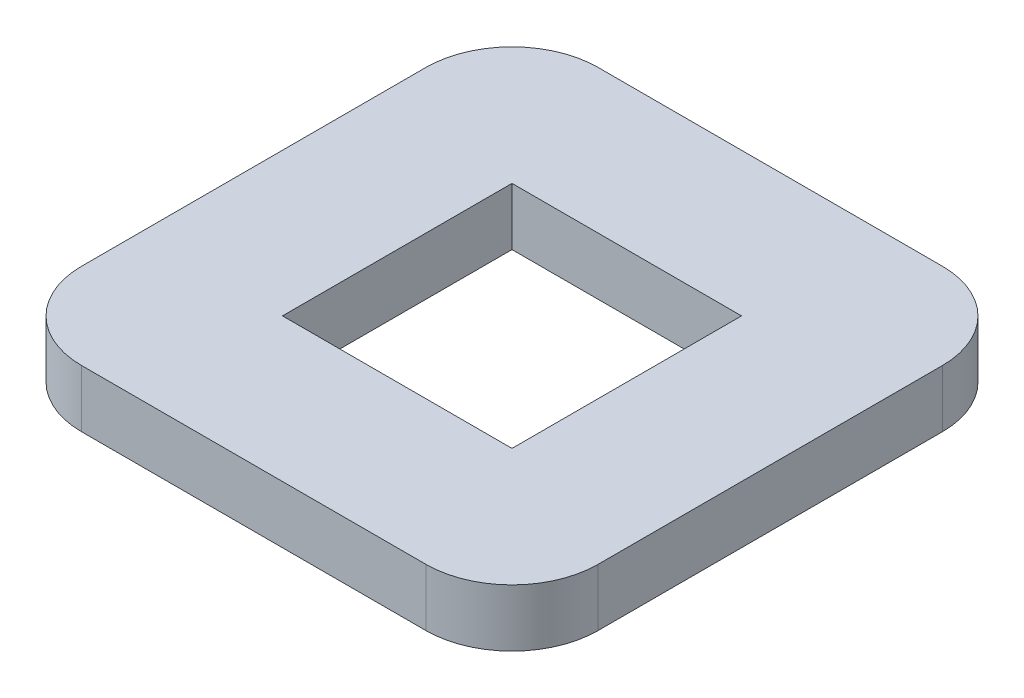
ISO-10303-21;
HEADER;
FILE_DESCRIPTION(('STEP AP214'),'2;1');
FILE_NAME('part.step','',(''),(''),'','','');
FILE_SCHEMA(('AUTOMOTIVE_DESIGN { 1 0 10303 214 1 1 1 1 }'));
ENDSEC;
DATA;
#1=APPLICATION_CONTEXT('core data for automotive mechanical design processes');
#2=APPLICATION_PROTOCOL_DEFINITION('international standard','automotive_design',2000,#1);
#3=PRODUCT_CONTEXT('',#1,'mechanical');
#4=PRODUCT('Part','Part','',(#3));
#5=PRODUCT_RELATED_PRODUCT_CATEGORY('part','',(#4));
#6=PRODUCT_DEFINITION_FORMATION('','',#4);
#7=PRODUCT_DEFINITION_CONTEXT('part definition',#1,'design');
#8=PRODUCT_DEFINITION('design','',#6,#7);
#9=PRODUCT_DEFINITION_SHAPE('','',#8);
#10=(LENGTH_UNIT() NAMED_UNIT(*) SI_UNIT(.MILLI.,.METRE.));
#11=(NAMED_UNIT(*) PLANE_ANGLE_UNIT() SI_UNIT($,.RADIAN.));
#12=(NAMED_UNIT(*) SI_UNIT($,.STERADIAN.) SOLID_ANGLE_UNIT());
#13=UNCERTAINTY_MEASURE_WITH_UNIT(LENGTH_MEASURE(1.E-05),#10,'distance_accuracy_value','');
#14=(GEOMETRIC_REPRESENTATION_CONTEXT(3) GLOBAL_UNCERTAINTY_ASSIGNED_CONTEXT((#13)) GLOBAL_UNIT_ASSIGNED_CONTEXT((#10,
#11,#12)) REPRESENTATION_CONTEXT('',''));
#15=CARTESIAN_POINT('',(0.,0.,0.));
#16=DIRECTION('',(0.,0.,1.));
#17=DIRECTION('',(1.,0.,0.));
#18=AXIS2_PLACEMENT_3D('',#15,#16,#17);
#19=CARTESIAN_POINT('',(6.,2.,-6.));
#20=DIRECTION('',(0.,-1.,0.));
#21=DIRECTION('',(0.,0.,-1.));
#22=AXIS2_PLACEMENT_3D('',#19,#20,#21);
#23=PLANE('',#22);
#24=CARTESIAN_POINT('',(6.,2.,-6.));
#25=DIRECTION('',(0.,1.,0.));
#26=DIRECTION('',(0.,0.,-1.));
#27=AXIS2_PLACEMENT_3D('',#24,#25,#26);
#28=CIRCLE('',#27,3.);
#29=CARTESIAN_POINT('',(9.,2.,-6.));
#30=VERTEX_POINT('',#29);
#31=CARTESIAN_POINT('',(6.,2.,-9.));
#32=VERTEX_POINT('',#31);
#33=EDGE_CURVE('E159',#30,#32,#28,.T.);
#34=ORIENTED_EDGE('',*,*,#33,.T.);
#35=DIRECTION('',(-1.,0.,0.));
#36=VECTOR('',#35,1.);
#37=CARTESIAN_POINT('',(-6.,2.,-9.));
#38=LINE('',#37,#36);
#39=CARTESIAN_POINT('',(-6.,2.,-9.));
#40=VERTEX_POINT('',#39);
#41=EDGE_CURVE('E162',#32,#40,#38,.T.);
#42=ORIENTED_EDGE('',*,*,#41,.T.);
#43=CARTESIAN_POINT('',(-6.,2.,-6.));
#44=DIRECTION('',(0.,1.,0.));
#45=DIRECTION('',(0.,0.,1.));
#46=AXIS2_PLACEMENT_3D('',#43,#44,#45);
#47=CIRCLE('',#46,3.);
#48=CARTESIAN_POINT('',(-9.,2.,-6.));
#49=VERTEX_POINT('',#48);
#50=EDGE_CURVE('E165',#40,#49,#47,.T.);
#51=ORIENTED_EDGE('',*,*,#50,.T.);
#52=DIRECTION('',(0.,0.,1.));
#53=VECTOR('',#52,1.);
#54=CARTESIAN_POINT('',(-9.,2.,-6.));
#55=LINE('',#54,#53);
#56=CARTESIAN_POINT('',(-9.,2.,6.));
#57=VERTEX_POINT('',#56);
#58=EDGE_CURVE('E167',#49,#57,#55,.T.);
#59=ORIENTED_EDGE('',*,*,#58,.T.);
#60=CARTESIAN_POINT('',(-6.,2.,6.));
#61=DIRECTION('',(0.,1.,0.));
#62=DIRECTION('',(0.,0.,-1.));
#63=AXIS2_PLACEMENT_3D('',#60,#61,#62);
#64=CIRCLE('',#63,3.);
#65=CARTESIAN_POINT('',(-6.,2.,9.));
#66=VERTEX_POINT('',#65);
#67=EDGE_CURVE('E169',#57,#66,#64,.T.);
#68=ORIENTED_EDGE('',*,*,#67,.T.);
#69=DIRECTION('',(1.,0.,0.));
#70=VECTOR('',#69,1.);
#71=CARTESIAN_POINT('',(-6.,2.,9.));
#72=LINE('',#71,#70);
#73=CARTESIAN_POINT('',(6.00000000000001,2.,9.));
#74=VERTEX_POINT('',#73);
#75=EDGE_CURVE('E171',#66,#74,#72,.T.);
#76=ORIENTED_EDGE('',*,*,#75,.T.);
#77=CARTESIAN_POINT('',(6.,2.,6.));
#78=DIRECTION('',(0.,1.,0.));
#79=DIRECTION('',(0.,0.,1.));
#80=AXIS2_PLACEMENT_3D('',#77,#78,#79);
#81=CIRCLE('',#80,3.);
#82=CARTESIAN_POINT('',(9.,2.,5.99999999999999));
#83=VERTEX_POINT('',#82);
#84=EDGE_CURVE('E173',#74,#83,#81,.T.);
#85=ORIENTED_EDGE('',*,*,#84,.T.);
#86=DIRECTION('',(0.,0.,-1.));
#87=VECTOR('',#86,1.);
#88=CARTESIAN_POINT('',(9.,2.,-6.));
#89=LINE('',#88,#87);
#90=EDGE_CURVE('E175',#83,#30,#89,.T.);
#91=ORIENTED_EDGE('',*,*,#90,.T.);
#92=EDGE_LOOP('',(#34,#42,#51,#59,#68,#76,#85,#91));
#93=FACE_BOUND('',#92,.T.);
#94=DIRECTION('',(0.,0.,1.));
#95=VECTOR('',#94,1.);
#96=CARTESIAN_POINT('',(-4.,2.,4.));
#97=LINE('',#96,#95);
#98=CARTESIAN_POINT('',(-4.,2.,-4.));
#99=VERTEX_POINT('',#98);
#100=CARTESIAN_POINT('',(-4.,2.,4.));
#101=VERTEX_POINT('',#100);
#102=EDGE_CURVE('E123',#99,#101,#97,.T.);
#103=ORIENTED_EDGE('',*,*,#102,.F.);
#104=DIRECTION('',(-1.,0.,0.));
#105=VECTOR('',#104,1.);
#106=CARTESIAN_POINT('',(4.,2.,-4.));
#107=LINE('',#106,#105);
#108=CARTESIAN_POINT('',(4.,2.,-4.));
#109=VERTEX_POINT('',#108);
#110=EDGE_CURVE('E145',#109,#99,#107,.T.);
#111=ORIENTED_EDGE('',*,*,#110,.F.);
#112=DIRECTION('',(0.,0.,-1.));
#113=VECTOR('',#112,1.);
#114=CARTESIAN_POINT('',(4.,2.,4.));
#115=LINE('',#114,#113);
#116=CARTESIAN_POINT('',(4.,2.,4.));
#117=VERTEX_POINT('',#116);
#118=EDGE_CURVE('E143',#117,#109,#115,.T.);
#119=ORIENTED_EDGE('',*,*,#118,.F.);
#120=DIRECTION('',(1.,0.,0.));
#121=VECTOR('',#120,1.);
#122=CARTESIAN_POINT('',(4.,2.,4.));
#123=LINE('',#122,#121);
#124=EDGE_CURVE('E131',#101,#117,#123,.T.);
#125=ORIENTED_EDGE('',*,*,#124,.F.);
#126=EDGE_LOOP('',(#103,#111,#119,#125));
#127=FACE_BOUND('',#126,.T.);
#128=ADVANCED_FACE('F34',(#93,#127),#23,.F.);
#129=CARTESIAN_POINT('',(6.,0.,-6.));
#130=DIRECTION('',(0.,-1.,0.));
#131=DIRECTION('',(0.,0.,-1.));
#132=AXIS2_PLACEMENT_3D('',#129,#130,#131);
#133=PLANE('',#132);
#134=CARTESIAN_POINT('',(6.,0.,-6.));
#135=DIRECTION('',(0.,1.,0.));
#136=DIRECTION('',(0.,0.,-1.));
#137=AXIS2_PLACEMENT_3D('',#134,#135,#136);
#138=CIRCLE('',#137,3.);
#139=CARTESIAN_POINT('',(9.,0.,-6.));
#140=VERTEX_POINT('',#139);
#141=CARTESIAN_POINT('',(6.,0.,-9.));
#142=VERTEX_POINT('',#141);
#143=EDGE_CURVE('E139',#140,#142,#138,.T.);
#144=ORIENTED_EDGE('',*,*,#143,.F.);
#145=DIRECTION('',(0.,0.,-1.));
#146=VECTOR('',#145,1.);
#147=CARTESIAN_POINT('',(9.,0.,-6.));
#148=LINE('',#147,#146);
#149=CARTESIAN_POINT('',(9.,0.,5.99999999999999));
#150=VERTEX_POINT('',#149);
#151=EDGE_CURVE('E163',#150,#140,#148,.T.);
#152=ORIENTED_EDGE('',*,*,#151,.F.);
#153=CARTESIAN_POINT('',(6.,0.,6.));
#154=DIRECTION('',(0.,1.,0.));
#155=DIRECTION('',(0.,0.,1.));
#156=AXIS2_PLACEMENT_3D('',#153,#154,#155);
#157=CIRCLE('',#156,3.);
#158=CARTESIAN_POINT('',(6.00000000000001,0.,9.));
#159=VERTEX_POINT('',#158);
#160=EDGE_CURVE('E190',#159,#150,#157,.T.);
#161=ORIENTED_EDGE('',*,*,#160,.F.);
#162=DIRECTION('',(1.,0.,0.));
#163=VECTOR('',#162,1.);
#164=CARTESIAN_POINT('',(-6.,0.,9.));
#165=LINE('',#164,#163);
#166=CARTESIAN_POINT('',(-6.,0.,9.));
#167=VERTEX_POINT('',#166);
#168=EDGE_CURVE('E188',#167,#159,#165,.T.);
#169=ORIENTED_EDGE('',*,*,#168,.F.);
#170=CARTESIAN_POINT('',(-6.,0.,6.));
#171=DIRECTION('',(0.,1.,0.));
#172=DIRECTION('',(0.,0.,-1.));
#173=AXIS2_PLACEMENT_3D('',#170,#171,#172);
#174=CIRCLE('',#173,3.);
#175=CARTESIAN_POINT('',(-9.,0.,6.));
#176=VERTEX_POINT('',#175);
#177=EDGE_CURVE('E186',#176,#167,#174,.T.);
#178=ORIENTED_EDGE('',*,*,#177,.F.);
#179=DIRECTION('',(0.,0.,1.));
#180=VECTOR('',#179,1.);
#181=CARTESIAN_POINT('',(-9.,0.,-6.));
#182=LINE('',#181,#180);
#183=CARTESIAN_POINT('',(-9.,0.,-6.));
#184=VERTEX_POINT('',#183);
#185=EDGE_CURVE('E184',#184,#176,#182,.T.);
#186=ORIENTED_EDGE('',*,*,#185,.F.);
#187=CARTESIAN_POINT('',(-6.,0.,-6.));
#188=DIRECTION('',(0.,1.,0.));
#189=DIRECTION('',(0.,0.,1.));
#190=AXIS2_PLACEMENT_3D('',#187,#188,#189);
#191=CIRCLE('',#190,3.);
#192=CARTESIAN_POINT('',(-6.,0.,-9.));
#193=VERTEX_POINT('',#192);
#194=EDGE_CURVE('E182',#193,#184,#191,.T.);
#195=ORIENTED_EDGE('',*,*,#194,.F.);
#196=DIRECTION('',(-1.,0.,0.));
#197=VECTOR('',#196,1.);
#198=CARTESIAN_POINT('',(-6.,0.,-9.));
#199=LINE('',#198,#197);
#200=EDGE_CURVE('E180',#142,#193,#199,.T.);
#201=ORIENTED_EDGE('',*,*,#200,.F.);
#202=EDGE_LOOP('',(#144,#152,#161,#169,#178,#186,#195,#201));
#203=FACE_BOUND('',#202,.T.);
#204=DIRECTION('',(-1.,0.,0.));
#205=VECTOR('',#204,1.);
#206=CARTESIAN_POINT('',(4.,0.,-4.));
#207=LINE('',#206,#205);
#208=CARTESIAN_POINT('',(4.,0.,-4.));
#209=VERTEX_POINT('',#208);
#210=CARTESIAN_POINT('',(-4.,0.,-4.));
#211=VERTEX_POINT('',#210);
#212=EDGE_CURVE('E132',#209,#211,#207,.T.);
#213=ORIENTED_EDGE('',*,*,#212,.T.);
#214=DIRECTION('',(0.,0.,1.));
#215=VECTOR('',#214,1.);
#216=CARTESIAN_POINT('',(-4.,0.,4.));
#217=LINE('',#216,#215);
#218=CARTESIAN_POINT('',(-4.,0.,4.));
#219=VERTEX_POINT('',#218);
#220=EDGE_CURVE('E57',#211,#219,#217,.T.);
#221=ORIENTED_EDGE('',*,*,#220,.T.);
#222=DIRECTION('',(1.,0.,0.));
#223=VECTOR('',#222,1.);
#224=CARTESIAN_POINT('',(4.,0.,4.));
#225=LINE('',#224,#223);
#226=CARTESIAN_POINT('',(4.,0.,4.));
#227=VERTEX_POINT('',#226);
#228=EDGE_CURVE('E138',#219,#227,#225,.T.);
#229=ORIENTED_EDGE('',*,*,#228,.T.);
#230=DIRECTION('',(0.,0.,-1.));
#231=VECTOR('',#230,1.);
#232=CARTESIAN_POINT('',(4.,0.,4.));
#233=LINE('',#232,#231);
#234=EDGE_CURVE('E151',#227,#209,#233,.T.);
#235=ORIENTED_EDGE('',*,*,#234,.T.);
#236=EDGE_LOOP('',(#213,#221,#229,#235));
#237=FACE_BOUND('',#236,.T.);
#238=ADVANCED_FACE('F220',(#203,#237),#133,.T.);
#239=CARTESIAN_POINT('',(6.,2.,-6.));
#240=DIRECTION('',(0.,-1.,0.));
#241=DIRECTION('',(0.,0.,-1.));
#242=AXIS2_PLACEMENT_3D('',#239,#240,#241);
#243=CYLINDRICAL_SURFACE('',#242,3.);
#244=ORIENTED_EDGE('',*,*,#143,.T.);
#245=DIRECTION('',(0.,-1.,0.));
#246=VECTOR('',#245,1.);
#247=CARTESIAN_POINT('',(6.,2.,-9.));
#248=LINE('',#247,#246);
#249=EDGE_CURVE('E11',#32,#142,#248,.T.);
#250=ORIENTED_EDGE('',*,*,#249,.F.);
#251=ORIENTED_EDGE('',*,*,#33,.F.);
#252=DIRECTION('',(0.,-1.,0.));
#253=VECTOR('',#252,1.);
#254=CARTESIAN_POINT('',(9.,2.,-6.));
#255=LINE('',#254,#253);
#256=EDGE_CURVE('E177',#30,#140,#255,.T.);
#257=ORIENTED_EDGE('',*,*,#256,.T.);
#258=EDGE_LOOP('',(#244,#250,#251,#257));
#259=FACE_BOUND('',#258,.T.);
#260=ADVANCED_FACE('F36',(#259),#243,.T.);
#261=CARTESIAN_POINT('',(-6.,2.,-9.));
#262=DIRECTION('',(0.,0.,1.));
#263=DIRECTION('',(1.,0.,0.));
#264=AXIS2_PLACEMENT_3D('',#261,#262,#263);
#265=PLANE('',#264);
#266=ORIENTED_EDGE('',*,*,#200,.T.);
#267=DIRECTION('',(0.,-1.,0.));
#268=VECTOR('',#267,1.);
#269=CARTESIAN_POINT('',(-6.,2.,-9.));
#270=LINE('',#269,#268);
#271=EDGE_CURVE('E42',#40,#193,#270,.T.);
#272=ORIENTED_EDGE('',*,*,#271,.F.);
#273=ORIENTED_EDGE('',*,*,#41,.F.);
#274=ORIENTED_EDGE('',*,*,#249,.T.);
#275=EDGE_LOOP('',(#266,#272,#273,#274));
#276=FACE_BOUND('',#275,.T.);
#277=ADVANCED_FACE('F237',(#276),#265,.F.);
#278=CARTESIAN_POINT('',(-6.,2.,-6.));
#279=DIRECTION('',(0.,-1.,0.));
#280=DIRECTION('',(0.,0.,-1.));
#281=AXIS2_PLACEMENT_3D('',#278,#279,#280);
#282=CYLINDRICAL_SURFACE('',#281,3.);
#283=ORIENTED_EDGE('',*,*,#194,.T.);
#284=DIRECTION('',(0.,-1.,0.));
#285=VECTOR('',#284,1.);
#286=CARTESIAN_POINT('',(-9.,2.,-6.));
#287=LINE('',#286,#285);
#288=EDGE_CURVE('E207',#49,#184,#287,.T.);
#289=ORIENTED_EDGE('',*,*,#288,.F.);
#290=ORIENTED_EDGE('',*,*,#50,.F.);
#291=ORIENTED_EDGE('',*,*,#271,.T.);
#292=EDGE_LOOP('',(#283,#289,#290,#291));
#293=FACE_BOUND('',#292,.T.);
#294=ADVANCED_FACE('F214',(#293),#282,.T.);
#295=CARTESIAN_POINT('',(-9.,2.,-6.));
#296=DIRECTION('',(1.,0.,0.));
#297=DIRECTION('',(0.,0.,-1.));
#298=AXIS2_PLACEMENT_3D('',#295,#296,#297);
#299=PLANE('',#298);
#300=ORIENTED_EDGE('',*,*,#185,.T.);
#301=DIRECTION('',(0.,-1.,0.));
#302=VECTOR('',#301,1.);
#303=CARTESIAN_POINT('',(-9.,2.,6.));
#304=LINE('',#303,#302);
#305=EDGE_CURVE('E204',#57,#176,#304,.T.);
#306=ORIENTED_EDGE('',*,*,#305,.F.);
#307=ORIENTED_EDGE('',*,*,#58,.F.);
#308=ORIENTED_EDGE('',*,*,#288,.T.);
#309=EDGE_LOOP('',(#300,#306,#307,#308));
#310=FACE_BOUND('',#309,.T.);
#311=ADVANCED_FACE('F226',(#310),#299,.F.);
#312=CARTESIAN_POINT('',(-6.,2.,6.));
#313=DIRECTION('',(0.,-1.,0.));
#314=DIRECTION('',(0.,0.,-1.));
#315=AXIS2_PLACEMENT_3D('',#312,#313,#314);
#316=CYLINDRICAL_SURFACE('',#315,3.);
#317=ORIENTED_EDGE('',*,*,#177,.T.);
#318=DIRECTION('',(0.,-1.,0.));
#319=VECTOR('',#318,1.);
#320=CARTESIAN_POINT('',(-6.,2.,9.));
#321=LINE('',#320,#319);
#322=EDGE_CURVE('E201',#66,#167,#321,.T.);
#323=ORIENTED_EDGE('',*,*,#322,.F.);
#324=ORIENTED_EDGE('',*,*,#67,.F.);
#325=ORIENTED_EDGE('',*,*,#305,.T.);
#326=EDGE_LOOP('',(#317,#323,#324,#325));
#327=FACE_BOUND('',#326,.T.);
#328=ADVANCED_FACE('F230',(#327),#316,.T.);
#329=CARTESIAN_POINT('',(-6.,2.,9.));
#330=DIRECTION('',(0.,0.,-1.));
#331=DIRECTION('',(-1.,0.,0.));
#332=AXIS2_PLACEMENT_3D('',#329,#330,#331);
#333=PLANE('',#332);
#334=ORIENTED_EDGE('',*,*,#168,.T.);
#335=DIRECTION('',(0.,-1.,0.));
#336=VECTOR('',#335,1.);
#337=CARTESIAN_POINT('',(6.00000000000001,2.,9.));
#338=LINE('',#337,#336);
#339=EDGE_CURVE('E198',#74,#159,#338,.T.);
#340=ORIENTED_EDGE('',*,*,#339,.F.);
#341=ORIENTED_EDGE('',*,*,#75,.F.);
#342=ORIENTED_EDGE('',*,*,#322,.T.);
#343=EDGE_LOOP('',(#334,#340,#341,#342));
#344=FACE_BOUND('',#343,.T.);
#345=ADVANCED_FACE('F250',(#344),#333,.F.);
#346=CARTESIAN_POINT('',(6.,2.,6.));
#347=DIRECTION('',(0.,-1.,0.));
#348=DIRECTION('',(0.,0.,-1.));
#349=AXIS2_PLACEMENT_3D('',#346,#347,#348);
#350=CYLINDRICAL_SURFACE('',#349,3.);
#351=ORIENTED_EDGE('',*,*,#160,.T.);
#352=DIRECTION('',(0.,-1.,0.));
#353=VECTOR('',#352,1.);
#354=CARTESIAN_POINT('',(9.,2.,5.99999999999999));
#355=LINE('',#354,#353);
#356=EDGE_CURVE('E195',#83,#150,#355,.T.);
#357=ORIENTED_EDGE('',*,*,#356,.F.);
#358=ORIENTED_EDGE('',*,*,#84,.F.);
#359=ORIENTED_EDGE('',*,*,#339,.T.);
#360=EDGE_LOOP('',(#351,#357,#358,#359));
#361=FACE_BOUND('',#360,.T.);
#362=ADVANCED_FACE('F248',(#361),#350,.T.);
#363=CARTESIAN_POINT('',(9.,2.,-6.));
#364=DIRECTION('',(-1.,0.,0.));
#365=DIRECTION('',(0.,0.,1.));
#366=AXIS2_PLACEMENT_3D('',#363,#364,#365);
#367=PLANE('',#366);
#368=ORIENTED_EDGE('',*,*,#151,.T.);
#369=ORIENTED_EDGE('',*,*,#256,.F.);
#370=ORIENTED_EDGE('',*,*,#90,.F.);
#371=ORIENTED_EDGE('',*,*,#356,.T.);
#372=EDGE_LOOP('',(#368,#369,#370,#371));
#373=FACE_BOUND('',#372,.T.);
#374=ADVANCED_FACE('F243',(#373),#367,.F.);
#375=CARTESIAN_POINT('',(-4.,2.,4.));
#376=DIRECTION('',(1.,0.,0.));
#377=DIRECTION('',(0.,0.,-1.));
#378=AXIS2_PLACEMENT_3D('',#375,#376,#377);
#379=PLANE('',#378);
#380=ORIENTED_EDGE('',*,*,#220,.F.);
#381=DIRECTION('',(0.,-1.,0.));
#382=VECTOR('',#381,1.);
#383=CARTESIAN_POINT('',(-4.,2.,-4.));
#384=LINE('',#383,#382);
#385=EDGE_CURVE('E127',#99,#211,#384,.T.);
#386=ORIENTED_EDGE('',*,*,#385,.F.);
#387=ORIENTED_EDGE('',*,*,#102,.T.);
#388=DIRECTION('',(0.,-1.,0.));
#389=VECTOR('',#388,1.);
#390=CARTESIAN_POINT('',(-4.,2.,4.));
#391=LINE('',#390,#389);
#392=EDGE_CURVE('E126',#101,#219,#391,.T.);
#393=ORIENTED_EDGE('',*,*,#392,.T.);
#394=EDGE_LOOP('',(#380,#386,#387,#393));
#395=FACE_BOUND('',#394,.T.);
#396=ADVANCED_FACE('F125',(#395),#379,.T.);
#397=CARTESIAN_POINT('',(4.,2.,4.));
#398=DIRECTION('',(0.,0.,-1.));
#399=DIRECTION('',(-1.,0.,0.));
#400=AXIS2_PLACEMENT_3D('',#397,#398,#399);
#401=PLANE('',#400);
#402=ORIENTED_EDGE('',*,*,#228,.F.);
#403=ORIENTED_EDGE('',*,*,#392,.F.);
#404=ORIENTED_EDGE('',*,*,#124,.T.);
#405=DIRECTION('',(0.,-1.,0.));
#406=VECTOR('',#405,1.);
#407=CARTESIAN_POINT('',(4.,2.,4.));
#408=LINE('',#407,#406);
#409=EDGE_CURVE('E140',#117,#227,#408,.T.);
#410=ORIENTED_EDGE('',*,*,#409,.T.);
#411=EDGE_LOOP('',(#402,#403,#404,#410));
#412=FACE_BOUND('',#411,.T.);
#413=ADVANCED_FACE('F135',(#412),#401,.T.);
#414=CARTESIAN_POINT('',(4.,2.,4.));
#415=DIRECTION('',(-1.,0.,0.));
#416=DIRECTION('',(0.,0.,1.));
#417=AXIS2_PLACEMENT_3D('',#414,#415,#416);
#418=PLANE('',#417);
#419=ORIENTED_EDGE('',*,*,#234,.F.);
#420=ORIENTED_EDGE('',*,*,#409,.F.);
#421=ORIENTED_EDGE('',*,*,#118,.T.);
#422=DIRECTION('',(0.,-1.,0.));
#423=VECTOR('',#422,1.);
#424=CARTESIAN_POINT('',(4.,2.,-4.));
#425=LINE('',#424,#423);
#426=EDGE_CURVE('E49',#109,#209,#425,.T.);
#427=ORIENTED_EDGE('',*,*,#426,.T.);
#428=EDGE_LOOP('',(#419,#420,#421,#427));
#429=FACE_BOUND('',#428,.T.);
#430=ADVANCED_FACE('F275',(#429),#418,.T.);
#431=CARTESIAN_POINT('',(4.,2.,-4.));
#432=DIRECTION('',(0.,0.,1.));
#433=DIRECTION('',(1.,0.,0.));
#434=AXIS2_PLACEMENT_3D('',#431,#432,#433);
#435=PLANE('',#434);
#436=ORIENTED_EDGE('',*,*,#212,.F.);
#437=ORIENTED_EDGE('',*,*,#426,.F.);
#438=ORIENTED_EDGE('',*,*,#110,.T.);
#439=ORIENTED_EDGE('',*,*,#385,.T.);
#440=EDGE_LOOP('',(#436,#437,#438,#439));
#441=FACE_BOUND('',#440,.T.);
#442=ADVANCED_FACE('F279',(#441),#435,.T.);
#443=CLOSED_SHELL('',(#128,#238,#260,#277,#294,#311,#328,#345,#362,#374,#396,#413,#430,#442));
#444=MANIFOLD_SOLID_BREP('B2',#443);
#445=ADVANCED_BREP_SHAPE_REPRESENTATION('',(#18,#444),#14);
#446=SHAPE_DEFINITION_REPRESENTATION(#9,#445);
ENDSEC;
END-ISO-10303-21;
